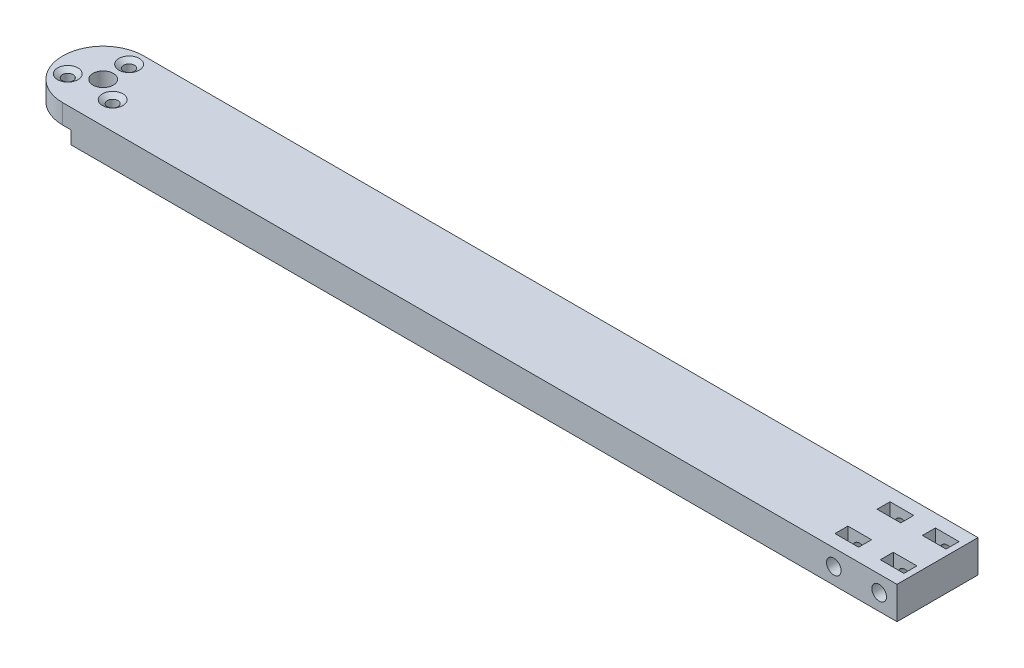
ISO-10303-21;
HEADER;
FILE_DESCRIPTION(('STEP AP214'),'2;1');
FILE_NAME('part.step','',(''),(''),'','','');
FILE_SCHEMA(('AUTOMOTIVE_DESIGN { 1 0 10303 214 1 1 1 1 }'));
ENDSEC;
DATA;
#1=APPLICATION_CONTEXT('core data for automotive mechanical design processes');
#2=APPLICATION_PROTOCOL_DEFINITION('international standard','automotive_design',2000,#1);
#3=PRODUCT_CONTEXT('',#1,'mechanical');
#4=PRODUCT('Part','Part','',(#3));
#5=PRODUCT_RELATED_PRODUCT_CATEGORY('part','',(#4));
#6=PRODUCT_DEFINITION_FORMATION('','',#4);
#7=PRODUCT_DEFINITION_CONTEXT('part definition',#1,'design');
#8=PRODUCT_DEFINITION('design','',#6,#7);
#9=PRODUCT_DEFINITION_SHAPE('','',#8);
#10=(LENGTH_UNIT() NAMED_UNIT(*) SI_UNIT(.MILLI.,.METRE.));
#11=(NAMED_UNIT(*) PLANE_ANGLE_UNIT() SI_UNIT($,.RADIAN.));
#12=(NAMED_UNIT(*) SI_UNIT($,.STERADIAN.) SOLID_ANGLE_UNIT());
#13=UNCERTAINTY_MEASURE_WITH_UNIT(LENGTH_MEASURE(1.E-05),#10,'distance_accuracy_value','');
#14=(GEOMETRIC_REPRESENTATION_CONTEXT(3) GLOBAL_UNCERTAINTY_ASSIGNED_CONTEXT((#13)) GLOBAL_UNIT_ASSIGNED_CONTEXT((#10,
#11,#12)) REPRESENTATION_CONTEXT('',''));
#15=CARTESIAN_POINT('',(0.,0.,0.));
#16=DIRECTION('',(0.,0.,1.));
#17=DIRECTION('',(1.,0.,0.));
#18=AXIS2_PLACEMENT_3D('',#15,#16,#17);
#19=CARTESIAN_POINT('',(12.5,-0.000999999999999265,-12.5));
#20=DIRECTION('',(0.,1.,0.));
#21=DIRECTION('',(0.,0.,1.));
#22=AXIS2_PLACEMENT_3D('',#19,#20,#21);
#23=CYLINDRICAL_SURFACE('',#22,3.15);
#24=CARTESIAN_POINT('',(12.5,10.,-12.5));
#25=DIRECTION('',(0.,1.,0.));
#26=DIRECTION('',(0.,0.,1.));
#27=AXIS2_PLACEMENT_3D('',#24,#25,#26);
#28=CIRCLE('',#27,3.15);
#29=CARTESIAN_POINT('',(12.5,10.,-9.35));
#30=VERTEX_POINT('',#29);
#31=EDGE_CURVE('E254',#30,#30,#28,.T.);
#32=ORIENTED_EDGE('',*,*,#31,.T.);
#33=EDGE_LOOP('',(#32));
#34=FACE_BOUND('',#33,.T.);
#35=CARTESIAN_POINT('',(12.5,4.,-12.5));
#36=DIRECTION('',(0.,-1.,0.));
#37=DIRECTION('',(0.,0.,-1.));
#38=AXIS2_PLACEMENT_3D('',#35,#36,#37);
#39=CIRCLE('',#38,3.15);
#40=CARTESIAN_POINT('',(12.5,4.,-15.65));
#41=VERTEX_POINT('',#40);
#42=EDGE_CURVE('E211',#41,#41,#39,.F.);
#43=ORIENTED_EDGE('',*,*,#42,.F.);
#44=EDGE_LOOP('',(#43));
#45=FACE_BOUND('',#44,.T.);
#46=ADVANCED_FACE('F43',(#34,#45),#23,.F.);
#47=CARTESIAN_POINT('',(12.5,10.,-12.5));
#48=DIRECTION('',(0.,-1.,0.));
#49=DIRECTION('',(0.,0.,-1.));
#50=AXIS2_PLACEMENT_3D('',#47,#48,#49);
#51=CYLINDRICAL_SURFACE('',#50,12.5);
#52=DIRECTION('',(0.,-1.,0.));
#53=VECTOR('',#52,1.);
#54=CARTESIAN_POINT('',(12.5,10.,-25.));
#55=LINE('',#54,#53);
#56=CARTESIAN_POINT('',(12.5,4.,-25.));
#57=VERTEX_POINT('',#56);
#58=CARTESIAN_POINT('',(12.5,10.,-25.));
#59=VERTEX_POINT('',#58);
#60=EDGE_CURVE('E248',#57,#59,#55,.F.);
#61=ORIENTED_EDGE('',*,*,#60,.F.);
#62=CARTESIAN_POINT('',(12.5,4.,-12.5));
#63=DIRECTION('',(0.,-1.,0.));
#64=DIRECTION('',(0.,0.,-1.));
#65=AXIS2_PLACEMENT_3D('',#62,#63,#64);
#66=CIRCLE('',#65,12.5);
#67=CARTESIAN_POINT('',(0.,4.,-12.5));
#68=VERTEX_POINT('',#67);
#69=EDGE_CURVE('E343',#57,#68,#66,.F.);
#70=ORIENTED_EDGE('',*,*,#69,.T.);
#71=DIRECTION('',(0.,-1.,0.));
#72=VECTOR('',#71,1.);
#73=CARTESIAN_POINT('',(0.,10.,-12.5));
#74=LINE('',#73,#72);
#75=CARTESIAN_POINT('',(0.,10.,-12.5));
#76=VERTEX_POINT('',#75);
#77=EDGE_CURVE('E251',#76,#68,#74,.T.);
#78=ORIENTED_EDGE('',*,*,#77,.F.);
#79=CARTESIAN_POINT('',(12.5,10.,-12.5));
#80=DIRECTION('',(0.,-1.,0.));
#81=DIRECTION('',(0.,0.,-1.));
#82=AXIS2_PLACEMENT_3D('',#79,#80,#81);
#83=CIRCLE('',#82,12.5);
#84=EDGE_CURVE('E244',#59,#76,#83,.F.);
#85=ORIENTED_EDGE('',*,*,#84,.F.);
#86=EDGE_LOOP('',(#61,#70,#78,#85));
#87=FACE_BOUND('',#86,.T.);
#88=ADVANCED_FACE('F289',(#87),#51,.T.);
#89=CARTESIAN_POINT('',(12.5,10.,-12.5));
#90=DIRECTION('',(0.,-1.,0.));
#91=DIRECTION('',(0.,0.,-1.));
#92=AXIS2_PLACEMENT_3D('',#89,#90,#91);
#93=CYLINDRICAL_SURFACE('',#92,12.5);
#94=ORIENTED_EDGE('',*,*,#77,.T.);
#95=CARTESIAN_POINT('',(12.5,4.,-12.5));
#96=DIRECTION('',(0.,-1.,0.));
#97=DIRECTION('',(0.,0.,-1.));
#98=AXIS2_PLACEMENT_3D('',#95,#96,#97);
#99=CIRCLE('',#98,12.5);
#100=CARTESIAN_POINT('',(12.5,4.,0.));
#101=VERTEX_POINT('',#100);
#102=EDGE_CURVE('E250',#68,#101,#99,.F.);
#103=ORIENTED_EDGE('',*,*,#102,.T.);
#104=DIRECTION('',(0.,-1.,0.));
#105=VECTOR('',#104,1.);
#106=CARTESIAN_POINT('',(12.5,10.,0.));
#107=LINE('',#106,#105);
#108=CARTESIAN_POINT('',(12.5,10.,0.));
#109=VERTEX_POINT('',#108);
#110=EDGE_CURVE('E241',#109,#101,#107,.T.);
#111=ORIENTED_EDGE('',*,*,#110,.F.);
#112=CARTESIAN_POINT('',(12.5,10.,-12.5));
#113=DIRECTION('',(0.,-1.,0.));
#114=DIRECTION('',(0.,0.,-1.));
#115=AXIS2_PLACEMENT_3D('',#112,#113,#114);
#116=CIRCLE('',#115,12.5);
#117=EDGE_CURVE('E246',#76,#109,#116,.F.);
#118=ORIENTED_EDGE('',*,*,#117,.F.);
#119=EDGE_LOOP('',(#94,#103,#111,#118));
#120=FACE_BOUND('',#119,.T.);
#121=ADVANCED_FACE('F295',(#120),#93,.T.);
#122=CARTESIAN_POINT('',(250.5,5.00000000000016,0.));
#123=DIRECTION('',(0.,0.,-1.));
#124=DIRECTION('',(-1.,0.,0.));
#125=AXIS2_PLACEMENT_3D('',#122,#123,#124);
#126=CYLINDRICAL_SURFACE('',#125,2.24999999999995);
#127=CARTESIAN_POINT('',(250.5,5.00000000000016,-20.9999999999999));
#128=DIRECTION('',(0.,0.,-1.));
#129=DIRECTION('',(-1.,0.,0.));
#130=AXIS2_PLACEMENT_3D('',#127,#128,#129);
#131=CIRCLE('',#130,2.24999999999995);
#132=CARTESIAN_POINT('',(248.25,5.00000000000016,-20.9999999999999));
#133=VERTEX_POINT('',#132);
#134=EDGE_CURVE('E401',#133,#133,#131,.T.);
#135=ORIENTED_EDGE('',*,*,#134,.F.);
#136=EDGE_LOOP('',(#135));
#137=FACE_BOUND('',#136,.T.);
#138=CARTESIAN_POINT('',(250.5,5.00000000000016,-25.));
#139=DIRECTION('',(0.,0.,-1.));
#140=DIRECTION('',(-1.,0.,0.));
#141=AXIS2_PLACEMENT_3D('',#138,#139,#140);
#142=CIRCLE('',#141,2.24999999999995);
#143=CARTESIAN_POINT('',(248.25,5.00000000000016,-25.));
#144=VERTEX_POINT('',#143);
#145=EDGE_CURVE('E469',#144,#144,#142,.T.);
#146=ORIENTED_EDGE('',*,*,#145,.T.);
#147=EDGE_LOOP('',(#146));
#148=FACE_BOUND('',#147,.T.);
#149=ADVANCED_FACE('F323',(#137,#148),#126,.F.);
#150=CARTESIAN_POINT('',(264.5,4.99999999999997,0.));
#151=DIRECTION('',(0.,0.,-1.));
#152=DIRECTION('',(-1.,0.,0.));
#153=AXIS2_PLACEMENT_3D('',#150,#151,#152);
#154=CYLINDRICAL_SURFACE('',#153,2.25000000000007);
#155=CARTESIAN_POINT('',(264.5,4.99999999999997,-4.));
#156=DIRECTION('',(0.,0.,1.));
#157=DIRECTION('',(1.,0.,0.));
#158=AXIS2_PLACEMENT_3D('',#155,#156,#157);
#159=CIRCLE('',#158,2.25000000000007);
#160=CARTESIAN_POINT('',(266.75,4.99999999999997,-4.));
#161=VERTEX_POINT('',#160);
#162=EDGE_CURVE('E420',#161,#161,#159,.T.);
#163=ORIENTED_EDGE('',*,*,#162,.F.);
#164=EDGE_LOOP('',(#163));
#165=FACE_BOUND('',#164,.T.);
#166=CARTESIAN_POINT('',(264.5,4.99999999999997,0.));
#167=DIRECTION('',(0.,0.,-1.));
#168=DIRECTION('',(-1.,0.,0.));
#169=AXIS2_PLACEMENT_3D('',#166,#167,#168);
#170=CIRCLE('',#169,2.25000000000007);
#171=CARTESIAN_POINT('',(262.25,4.99999999999997,0.));
#172=VERTEX_POINT('',#171);
#173=EDGE_CURVE('E255',#172,#172,#170,.T.);
#174=ORIENTED_EDGE('',*,*,#173,.F.);
#175=EDGE_LOOP('',(#174));
#176=FACE_BOUND('',#175,.T.);
#177=ADVANCED_FACE('F320',(#165,#176),#154,.F.);
#178=CARTESIAN_POINT('',(0.,10.,0.));
#179=DIRECTION('',(0.,0.,-1.));
#180=DIRECTION('',(-1.,0.,0.));
#181=AXIS2_PLACEMENT_3D('',#178,#179,#180);
#182=PLANE('',#181);
#183=ORIENTED_EDGE('',*,*,#173,.T.);
#184=EDGE_LOOP('',(#183));
#185=FACE_BOUND('',#184,.T.);
#186=CARTESIAN_POINT('',(250.5,5.00000000000016,0.));
#187=DIRECTION('',(0.,0.,-1.));
#188=DIRECTION('',(-1.,0.,0.));
#189=AXIS2_PLACEMENT_3D('',#186,#187,#188);
#190=CIRCLE('',#189,2.24999999999995);
#191=CARTESIAN_POINT('',(248.25,5.00000000000016,0.));
#192=VERTEX_POINT('',#191);
#193=EDGE_CURVE('E509',#192,#192,#190,.T.);
#194=ORIENTED_EDGE('',*,*,#193,.T.);
#195=EDGE_LOOP('',(#194));
#196=FACE_BOUND('',#195,.T.);
#197=DIRECTION('',(-1.,0.,0.));
#198=VECTOR('',#197,1.);
#199=CARTESIAN_POINT('',(0.,4.,0.));
#200=LINE('',#199,#198);
#201=CARTESIAN_POINT('',(15.0124689052802,4.,0.));
#202=VERTEX_POINT('',#201);
#203=EDGE_CURVE('E59',#202,#101,#200,.T.);
#204=ORIENTED_EDGE('',*,*,#203,.F.);
#205=DIRECTION('',(0.,-1.,0.));
#206=VECTOR('',#205,1.);
#207=CARTESIAN_POINT('',(15.0124689052802,4.,0.));
#208=LINE('',#207,#206);
#209=CARTESIAN_POINT('',(15.0124689052802,0.,0.));
#210=VERTEX_POINT('',#209);
#211=EDGE_CURVE('E210',#202,#210,#208,.T.);
#212=ORIENTED_EDGE('',*,*,#211,.T.);
#213=DIRECTION('',(1.,0.,0.));
#214=VECTOR('',#213,1.);
#215=CARTESIAN_POINT('',(0.,0.,0.));
#216=LINE('',#215,#214);
#217=CARTESIAN_POINT('',(270.,0.,0.));
#218=VERTEX_POINT('',#217);
#219=EDGE_CURVE('E220',#210,#218,#216,.T.);
#220=ORIENTED_EDGE('',*,*,#219,.T.);
#221=DIRECTION('',(0.,-1.,0.));
#222=VECTOR('',#221,1.);
#223=CARTESIAN_POINT('',(270.,10.,0.));
#224=LINE('',#223,#222);
#225=CARTESIAN_POINT('',(270.,10.,0.));
#226=VERTEX_POINT('',#225);
#227=EDGE_CURVE('E237',#226,#218,#224,.T.);
#228=ORIENTED_EDGE('',*,*,#227,.F.);
#229=DIRECTION('',(1.,0.,0.));
#230=VECTOR('',#229,1.);
#231=CARTESIAN_POINT('',(0.,10.,0.));
#232=LINE('',#231,#230);
#233=EDGE_CURVE('E228',#109,#226,#232,.T.);
#234=ORIENTED_EDGE('',*,*,#233,.F.);
#235=ORIENTED_EDGE('',*,*,#110,.T.);
#236=EDGE_LOOP('',(#204,#212,#220,#228,#234,#235));
#237=FACE_BOUND('',#236,.T.);
#238=ADVANCED_FACE('F316',(#185,#196,#237),#182,.F.);
#239=CARTESIAN_POINT('',(270.,10.,0.));
#240=DIRECTION('',(-1.,0.,0.));
#241=DIRECTION('',(0.,0.,1.));
#242=AXIS2_PLACEMENT_3D('',#239,#240,#241);
#243=PLANE('',#242);
#244=DIRECTION('',(0.,0.,-1.));
#245=VECTOR('',#244,1.);
#246=CARTESIAN_POINT('',(270.,0.,0.));
#247=LINE('',#246,#245);
#248=CARTESIAN_POINT('',(270.,0.,-25.));
#249=VERTEX_POINT('',#248);
#250=EDGE_CURVE('E229',#218,#249,#247,.T.);
#251=ORIENTED_EDGE('',*,*,#250,.T.);
#252=DIRECTION('',(0.,-1.,0.));
#253=VECTOR('',#252,1.);
#254=CARTESIAN_POINT('',(270.,10.,-25.));
#255=LINE('',#254,#253);
#256=CARTESIAN_POINT('',(270.,10.,-25.));
#257=VERTEX_POINT('',#256);
#258=EDGE_CURVE('E227',#257,#249,#255,.T.);
#259=ORIENTED_EDGE('',*,*,#258,.F.);
#260=DIRECTION('',(0.,0.,-1.));
#261=VECTOR('',#260,1.);
#262=CARTESIAN_POINT('',(270.,10.,0.));
#263=LINE('',#262,#261);
#264=EDGE_CURVE('E231',#226,#257,#263,.T.);
#265=ORIENTED_EDGE('',*,*,#264,.F.);
#266=ORIENTED_EDGE('',*,*,#227,.T.);
#267=EDGE_LOOP('',(#251,#259,#265,#266));
#268=FACE_BOUND('',#267,.T.);
#269=ADVANCED_FACE('F312',(#268),#243,.F.);
#270=CARTESIAN_POINT('',(0.,10.,-25.));
#271=DIRECTION('',(0.,0.,1.));
#272=DIRECTION('',(1.,0.,0.));
#273=AXIS2_PLACEMENT_3D('',#270,#271,#272);
#274=PLANE('',#273);
#275=CARTESIAN_POINT('',(264.5,4.99999999999997,-25.));
#276=DIRECTION('',(0.,0.,-1.));
#277=DIRECTION('',(-1.,0.,0.));
#278=AXIS2_PLACEMENT_3D('',#275,#276,#277);
#279=CIRCLE('',#278,2.25000000000007);
#280=CARTESIAN_POINT('',(262.25,4.99999999999997,-25.));
#281=VERTEX_POINT('',#280);
#282=EDGE_CURVE('E506',#281,#281,#279,.T.);
#283=ORIENTED_EDGE('',*,*,#282,.F.);
#284=EDGE_LOOP('',(#283));
#285=FACE_BOUND('',#284,.T.);
#286=ORIENTED_EDGE('',*,*,#145,.F.);
#287=EDGE_LOOP('',(#286));
#288=FACE_BOUND('',#287,.T.);
#289=DIRECTION('',(-1.,0.,0.));
#290=VECTOR('',#289,1.);
#291=CARTESIAN_POINT('',(0.,0.,-25.));
#292=LINE('',#291,#290);
#293=CARTESIAN_POINT('',(15.0124689052802,0.,-25.));
#294=VERTEX_POINT('',#293);
#295=EDGE_CURVE('E219',#249,#294,#292,.T.);
#296=ORIENTED_EDGE('',*,*,#295,.T.);
#297=DIRECTION('',(0.,-1.,0.));
#298=VECTOR('',#297,1.);
#299=CARTESIAN_POINT('',(15.0124689052802,4.,-25.));
#300=LINE('',#299,#298);
#301=CARTESIAN_POINT('',(15.0124689052802,4.,-25.));
#302=VERTEX_POINT('',#301);
#303=EDGE_CURVE('E201',#294,#302,#300,.F.);
#304=ORIENTED_EDGE('',*,*,#303,.T.);
#305=DIRECTION('',(1.,0.,0.));
#306=VECTOR('',#305,1.);
#307=CARTESIAN_POINT('',(0.,4.,-25.));
#308=LINE('',#307,#306);
#309=EDGE_CURVE('E344',#57,#302,#308,.T.);
#310=ORIENTED_EDGE('',*,*,#309,.F.);
#311=ORIENTED_EDGE('',*,*,#60,.T.);
#312=DIRECTION('',(-1.,0.,0.));
#313=VECTOR('',#312,1.);
#314=CARTESIAN_POINT('',(0.,10.,-25.));
#315=LINE('',#314,#313);
#316=EDGE_CURVE('E238',#257,#59,#315,.T.);
#317=ORIENTED_EDGE('',*,*,#316,.F.);
#318=ORIENTED_EDGE('',*,*,#258,.T.);
#319=EDGE_LOOP('',(#296,#304,#310,#311,#317,#318));
#320=FACE_BOUND('',#319,.T.);
#321=ADVANCED_FACE('F224',(#285,#288,#320),#274,.F.);
#322=CARTESIAN_POINT('',(0.,10.,0.));
#323=DIRECTION('',(0.,-1.,0.));
#324=DIRECTION('',(0.,0.,-1.));
#325=AXIS2_PLACEMENT_3D('',#322,#323,#324);
#326=PLANE('',#325);
#327=CARTESIAN_POINT('',(5.57179676972453,10.,-8.49999999999998));
#328=DIRECTION('',(0.,-1.,0.));
#329=DIRECTION('',(0.,0.,-1.));
#330=AXIS2_PLACEMENT_3D('',#327,#328,#329);
#331=CIRCLE('',#330,3.14999999999999);
#332=CARTESIAN_POINT('',(5.57179676972453,10.,-11.65));
#333=VERTEX_POINT('',#332);
#334=EDGE_CURVE('E266',#333,#333,#331,.T.);
#335=ORIENTED_EDGE('',*,*,#334,.T.);
#336=EDGE_LOOP('',(#335));
#337=FACE_BOUND('',#336,.T.);
#338=CARTESIAN_POINT('',(19.4282032302756,10.,-8.50000000000001));
#339=DIRECTION('',(0.,-1.,0.));
#340=DIRECTION('',(0.,0.,-1.));
#341=AXIS2_PLACEMENT_3D('',#338,#339,#340);
#342=CIRCLE('',#341,3.14999999999993);
#343=CARTESIAN_POINT('',(19.4282032302756,10.,-11.6499999999999));
#344=VERTEX_POINT('',#343);
#345=EDGE_CURVE('E263',#344,#344,#342,.T.);
#346=ORIENTED_EDGE('',*,*,#345,.T.);
#347=EDGE_LOOP('',(#346));
#348=FACE_BOUND('',#347,.T.);
#349=CARTESIAN_POINT('',(12.5,10.,-20.5));
#350=DIRECTION('',(0.,-1.,0.));
#351=DIRECTION('',(0.,0.,-1.));
#352=AXIS2_PLACEMENT_3D('',#349,#350,#351);
#353=CIRCLE('',#352,3.14999999999999);
#354=CARTESIAN_POINT('',(12.5,10.,-23.65));
#355=VERTEX_POINT('',#354);
#356=EDGE_CURVE('E260',#355,#355,#353,.T.);
#357=ORIENTED_EDGE('',*,*,#356,.T.);
#358=EDGE_LOOP('',(#357));
#359=FACE_BOUND('',#358,.T.);
#360=DIRECTION('',(1.,0.,0.));
#361=VECTOR('',#360,1.);
#362=CARTESIAN_POINT('',(260.85,10.,-4.));
#363=LINE('',#362,#361);
#364=CARTESIAN_POINT('',(260.85,10.,-4.));
#365=VERTEX_POINT('',#364);
#366=CARTESIAN_POINT('',(268.15,10.,-4.));
#367=VERTEX_POINT('',#366);
#368=EDGE_CURVE('E67',#365,#367,#363,.T.);
#369=ORIENTED_EDGE('',*,*,#368,.F.);
#370=DIRECTION('',(0.,0.,1.));
#371=VECTOR('',#370,1.);
#372=CARTESIAN_POINT('',(260.85,10.,-8.));
#373=LINE('',#372,#371);
#374=CARTESIAN_POINT('',(260.85,10.,-8.));
#375=VERTEX_POINT('',#374);
#376=EDGE_CURVE('E407',#375,#365,#373,.T.);
#377=ORIENTED_EDGE('',*,*,#376,.F.);
#378=DIRECTION('',(-1.,0.,0.));
#379=VECTOR('',#378,1.);
#380=CARTESIAN_POINT('',(260.85,10.,-8.));
#381=LINE('',#380,#379);
#382=CARTESIAN_POINT('',(268.15,10.,-8.));
#383=VERTEX_POINT('',#382);
#384=EDGE_CURVE('E414',#383,#375,#381,.T.);
#385=ORIENTED_EDGE('',*,*,#384,.F.);
#386=DIRECTION('',(0.,0.,-1.));
#387=VECTOR('',#386,1.);
#388=CARTESIAN_POINT('',(268.15,10.,-8.));
#389=LINE('',#388,#387);
#390=EDGE_CURVE('E411',#367,#383,#389,.T.);
#391=ORIENTED_EDGE('',*,*,#390,.F.);
#392=EDGE_LOOP('',(#369,#377,#385,#391));
#393=FACE_BOUND('',#392,.T.);
#394=DIRECTION('',(-1.,0.,0.));
#395=VECTOR('',#394,1.);
#396=CARTESIAN_POINT('',(246.85,10.,-20.9999999999999));
#397=LINE('',#396,#395);
#398=CARTESIAN_POINT('',(254.15,10.,-20.9999999999999));
#399=VERTEX_POINT('',#398);
#400=CARTESIAN_POINT('',(246.85,10.,-20.9999999999999));
#401=VERTEX_POINT('',#400);
#402=EDGE_CURVE('E438',#399,#401,#397,.T.);
#403=ORIENTED_EDGE('',*,*,#402,.F.);
#404=DIRECTION('',(0.,0.,-1.));
#405=VECTOR('',#404,1.);
#406=CARTESIAN_POINT('',(254.15,10.,-16.9999999999999));
#407=LINE('',#406,#405);
#408=CARTESIAN_POINT('',(254.15,10.,-16.9999999999999));
#409=VERTEX_POINT('',#408);
#410=EDGE_CURVE('E449',#409,#399,#407,.T.);
#411=ORIENTED_EDGE('',*,*,#410,.F.);
#412=DIRECTION('',(1.,0.,0.));
#413=VECTOR('',#412,1.);
#414=CARTESIAN_POINT('',(246.85,10.,-16.9999999999999));
#415=LINE('',#414,#413);
#416=CARTESIAN_POINT('',(246.85,10.,-16.9999999999999));
#417=VERTEX_POINT('',#416);
#418=EDGE_CURVE('E446',#417,#409,#415,.T.);
#419=ORIENTED_EDGE('',*,*,#418,.F.);
#420=DIRECTION('',(0.,0.,1.));
#421=VECTOR('',#420,1.);
#422=CARTESIAN_POINT('',(246.85,10.,-16.9999999999999));
#423=LINE('',#422,#421);
#424=EDGE_CURVE('E443',#401,#417,#423,.T.);
#425=ORIENTED_EDGE('',*,*,#424,.F.);
#426=EDGE_LOOP('',(#403,#411,#419,#425));
#427=FACE_BOUND('',#426,.T.);
#428=DIRECTION('',(1.,0.,0.));
#429=VECTOR('',#428,1.);
#430=CARTESIAN_POINT('',(246.85,10.,-3.9999999999999));
#431=LINE('',#430,#429);
#432=CARTESIAN_POINT('',(246.85,10.,-3.9999999999999));
#433=VERTEX_POINT('',#432);
#434=CARTESIAN_POINT('',(254.15,10.,-3.99999999999991));
#435=VERTEX_POINT('',#434);
#436=EDGE_CURVE('E370',#433,#435,#431,.T.);
#437=ORIENTED_EDGE('',*,*,#436,.F.);
#438=DIRECTION('',(0.,0.,1.));
#439=VECTOR('',#438,1.);
#440=CARTESIAN_POINT('',(246.85,10.,-7.9999999999999));
#441=LINE('',#440,#439);
#442=CARTESIAN_POINT('',(246.85,10.,-7.9999999999999));
#443=VERTEX_POINT('',#442);
#444=EDGE_CURVE('E367',#443,#433,#441,.T.);
#445=ORIENTED_EDGE('',*,*,#444,.F.);
#446=DIRECTION('',(-1.,0.,0.));
#447=VECTOR('',#446,1.);
#448=CARTESIAN_POINT('',(246.85,10.,-7.9999999999999));
#449=LINE('',#448,#447);
#450=CARTESIAN_POINT('',(254.15,10.,-7.9999999999999));
#451=VERTEX_POINT('',#450);
#452=EDGE_CURVE('E375',#451,#443,#449,.T.);
#453=ORIENTED_EDGE('',*,*,#452,.F.);
#454=DIRECTION('',(0.,0.,-1.));
#455=VECTOR('',#454,1.);
#456=CARTESIAN_POINT('',(254.15,10.,-7.9999999999999));
#457=LINE('',#456,#455);
#458=EDGE_CURVE('E372',#435,#451,#457,.T.);
#459=ORIENTED_EDGE('',*,*,#458,.F.);
#460=EDGE_LOOP('',(#437,#445,#453,#459));
#461=FACE_BOUND('',#460,.T.);
#462=DIRECTION('',(-1.,0.,0.));
#463=VECTOR('',#462,1.);
#464=CARTESIAN_POINT('',(260.85,10.,-21.));
#465=LINE('',#464,#463);
#466=CARTESIAN_POINT('',(268.15,10.,-21.));
#467=VERTEX_POINT('',#466);
#468=CARTESIAN_POINT('',(260.85,10.,-21.));
#469=VERTEX_POINT('',#468);
#470=EDGE_CURVE('E482',#467,#469,#465,.T.);
#471=ORIENTED_EDGE('',*,*,#470,.F.);
#472=DIRECTION('',(0.,0.,-1.));
#473=VECTOR('',#472,1.);
#474=CARTESIAN_POINT('',(268.15,10.,-17.));
#475=LINE('',#474,#473);
#476=CARTESIAN_POINT('',(268.15,10.,-17.));
#477=VERTEX_POINT('',#476);
#478=EDGE_CURVE('E479',#477,#467,#475,.T.);
#479=ORIENTED_EDGE('',*,*,#478,.F.);
#480=DIRECTION('',(1.,0.,0.));
#481=VECTOR('',#480,1.);
#482=CARTESIAN_POINT('',(260.85,10.,-17.));
#483=LINE('',#482,#481);
#484=CARTESIAN_POINT('',(260.85,10.,-17.));
#485=VERTEX_POINT('',#484);
#486=EDGE_CURVE('E487',#485,#477,#483,.T.);
#487=ORIENTED_EDGE('',*,*,#486,.F.);
#488=DIRECTION('',(0.,0.,1.));
#489=VECTOR('',#488,1.);
#490=CARTESIAN_POINT('',(260.85,10.,-17.));
#491=LINE('',#490,#489);
#492=EDGE_CURVE('E484',#469,#485,#491,.T.);
#493=ORIENTED_EDGE('',*,*,#492,.F.);
#494=EDGE_LOOP('',(#471,#479,#487,#493));
#495=FACE_BOUND('',#494,.T.);
#496=ORIENTED_EDGE('',*,*,#31,.F.);
#497=EDGE_LOOP('',(#496));
#498=FACE_BOUND('',#497,.T.);
#499=ORIENTED_EDGE('',*,*,#84,.T.);
#500=ORIENTED_EDGE('',*,*,#117,.T.);
#501=ORIENTED_EDGE('',*,*,#233,.T.);
#502=ORIENTED_EDGE('',*,*,#264,.T.);
#503=ORIENTED_EDGE('',*,*,#316,.T.);
#504=EDGE_LOOP('',(#499,#500,#501,#502,#503));
#505=FACE_BOUND('',#504,.T.);
#506=ADVANCED_FACE('F304',(#337,#348,#359,#393,#427,#461,#495,#498,#505),#326,.F.);
#507=CARTESIAN_POINT('',(0.,0.,0.));
#508=DIRECTION('',(0.,-1.,0.));
#509=DIRECTION('',(0.,0.,-1.));
#510=AXIS2_PLACEMENT_3D('',#507,#508,#509);
#511=PLANE('',#510);
#512=CARTESIAN_POINT('',(12.5,0.,-12.5));
#513=DIRECTION('',(0.,-1.,0.));
#514=DIRECTION('',(0.,0.,-1.));
#515=AXIS2_PLACEMENT_3D('',#512,#513,#514);
#516=CIRCLE('',#515,12.75);
#517=EDGE_CURVE('E204',#294,#210,#516,.T.);
#518=ORIENTED_EDGE('',*,*,#517,.F.);
#519=ORIENTED_EDGE('',*,*,#295,.F.);
#520=ORIENTED_EDGE('',*,*,#250,.F.);
#521=ORIENTED_EDGE('',*,*,#219,.F.);
#522=EDGE_LOOP('',(#518,#519,#520,#521));
#523=FACE_BOUND('',#522,.T.);
#524=DIRECTION('',(0.,0.,1.));
#525=VECTOR('',#524,1.);
#526=CARTESIAN_POINT('',(260.85,0.,-8.));
#527=LINE('',#526,#525);
#528=CARTESIAN_POINT('',(260.85,0.,-8.));
#529=VERTEX_POINT('',#528);
#530=CARTESIAN_POINT('',(260.85,0.,-4.));
#531=VERTEX_POINT('',#530);
#532=EDGE_CURVE('E404',#529,#531,#527,.T.);
#533=ORIENTED_EDGE('',*,*,#532,.T.);
#534=DIRECTION('',(1.,0.,0.));
#535=VECTOR('',#534,1.);
#536=CARTESIAN_POINT('',(260.85,0.,-4.));
#537=LINE('',#536,#535);
#538=CARTESIAN_POINT('',(268.15,0.,-4.));
#539=VERTEX_POINT('',#538);
#540=EDGE_CURVE('E396',#531,#539,#537,.T.);
#541=ORIENTED_EDGE('',*,*,#540,.T.);
#542=DIRECTION('',(0.,0.,-1.));
#543=VECTOR('',#542,1.);
#544=CARTESIAN_POINT('',(268.15,0.,-8.));
#545=LINE('',#544,#543);
#546=CARTESIAN_POINT('',(268.15,0.,-8.));
#547=VERTEX_POINT('',#546);
#548=EDGE_CURVE('E397',#539,#547,#545,.T.);
#549=ORIENTED_EDGE('',*,*,#548,.T.);
#550=DIRECTION('',(-1.,0.,0.));
#551=VECTOR('',#550,1.);
#552=CARTESIAN_POINT('',(260.85,0.,-8.));
#553=LINE('',#552,#551);
#554=EDGE_CURVE('E400',#547,#529,#553,.T.);
#555=ORIENTED_EDGE('',*,*,#554,.T.);
#556=EDGE_LOOP('',(#533,#541,#549,#555));
#557=FACE_BOUND('',#556,.T.);
#558=DIRECTION('',(0.,0.,-1.));
#559=VECTOR('',#558,1.);
#560=CARTESIAN_POINT('',(254.15,0.,-16.9999999999999));
#561=LINE('',#560,#559);
#562=CARTESIAN_POINT('',(254.15,0.,-16.9999999999999));
#563=VERTEX_POINT('',#562);
#564=CARTESIAN_POINT('',(254.15,0.,-20.9999999999999));
#565=VERTEX_POINT('',#564);
#566=EDGE_CURVE('E432',#563,#565,#561,.T.);
#567=ORIENTED_EDGE('',*,*,#566,.T.);
#568=DIRECTION('',(-1.,0.,0.));
#569=VECTOR('',#568,1.);
#570=CARTESIAN_POINT('',(246.85,0.,-20.9999999999999));
#571=LINE('',#570,#569);
#572=CARTESIAN_POINT('',(246.85,0.,-20.9999999999999));
#573=VERTEX_POINT('',#572);
#574=EDGE_CURVE('E435',#565,#573,#571,.T.);
#575=ORIENTED_EDGE('',*,*,#574,.T.);
#576=DIRECTION('',(0.,0.,1.));
#577=VECTOR('',#576,1.);
#578=CARTESIAN_POINT('',(246.85,0.,-16.9999999999999));
#579=LINE('',#578,#577);
#580=CARTESIAN_POINT('',(246.85,0.,-16.9999999999999));
#581=VERTEX_POINT('',#580);
#582=EDGE_CURVE('E455',#573,#581,#579,.T.);
#583=ORIENTED_EDGE('',*,*,#582,.T.);
#584=DIRECTION('',(1.,0.,0.));
#585=VECTOR('',#584,1.);
#586=CARTESIAN_POINT('',(246.85,0.,-16.9999999999999));
#587=LINE('',#586,#585);
#588=EDGE_CURVE('E357',#581,#563,#587,.T.);
#589=ORIENTED_EDGE('',*,*,#588,.T.);
#590=EDGE_LOOP('',(#567,#575,#583,#589));
#591=FACE_BOUND('',#590,.T.);
#592=DIRECTION('',(0.,0.,1.));
#593=VECTOR('',#592,1.);
#594=CARTESIAN_POINT('',(246.85,0.,-7.9999999999999));
#595=LINE('',#594,#593);
#596=CARTESIAN_POINT('',(246.85,0.,-7.9999999999999));
#597=VERTEX_POINT('',#596);
#598=CARTESIAN_POINT('',(246.85,0.,-3.9999999999999));
#599=VERTEX_POINT('',#598);
#600=EDGE_CURVE('E364',#597,#599,#595,.T.);
#601=ORIENTED_EDGE('',*,*,#600,.T.);
#602=DIRECTION('',(1.,0.,0.));
#603=VECTOR('',#602,1.);
#604=CARTESIAN_POINT('',(246.85,0.,-3.9999999999999));
#605=LINE('',#604,#603);
#606=CARTESIAN_POINT('',(254.15,0.,-3.99999999999991));
#607=VERTEX_POINT('',#606);
#608=EDGE_CURVE('E358',#599,#607,#605,.T.);
#609=ORIENTED_EDGE('',*,*,#608,.T.);
#610=DIRECTION('',(0.,0.,-1.));
#611=VECTOR('',#610,1.);
#612=CARTESIAN_POINT('',(254.15,0.,-7.9999999999999));
#613=LINE('',#612,#611);
#614=CARTESIAN_POINT('',(254.15,0.,-7.9999999999999));
#615=VERTEX_POINT('',#614);
#616=EDGE_CURVE('E353',#607,#615,#613,.T.);
#617=ORIENTED_EDGE('',*,*,#616,.T.);
#618=DIRECTION('',(-1.,0.,0.));
#619=VECTOR('',#618,1.);
#620=CARTESIAN_POINT('',(246.85,0.,-7.9999999999999));
#621=LINE('',#620,#619);
#622=EDGE_CURVE('E361',#615,#597,#621,.T.);
#623=ORIENTED_EDGE('',*,*,#622,.T.);
#624=EDGE_LOOP('',(#601,#609,#617,#623));
#625=FACE_BOUND('',#624,.T.);
#626=DIRECTION('',(0.,0.,-1.));
#627=VECTOR('',#626,1.);
#628=CARTESIAN_POINT('',(268.15,0.,-17.));
#629=LINE('',#628,#627);
#630=CARTESIAN_POINT('',(268.15,0.,-17.));
#631=VERTEX_POINT('',#630);
#632=CARTESIAN_POINT('',(268.15,0.,-21.));
#633=VERTEX_POINT('',#632);
#634=EDGE_CURVE('E476',#631,#633,#629,.T.);
#635=ORIENTED_EDGE('',*,*,#634,.T.);
#636=DIRECTION('',(-1.,0.,0.));
#637=VECTOR('',#636,1.);
#638=CARTESIAN_POINT('',(260.85,0.,-21.));
#639=LINE('',#638,#637);
#640=CARTESIAN_POINT('',(260.85,0.,-21.));
#641=VERTEX_POINT('',#640);
#642=EDGE_CURVE('E470',#633,#641,#639,.T.);
#643=ORIENTED_EDGE('',*,*,#642,.T.);
#644=DIRECTION('',(0.,0.,1.));
#645=VECTOR('',#644,1.);
#646=CARTESIAN_POINT('',(260.85,0.,-17.));
#647=LINE('',#646,#645);
#648=CARTESIAN_POINT('',(260.85,0.,-17.));
#649=VERTEX_POINT('',#648);
#650=EDGE_CURVE('E395',#641,#649,#647,.T.);
#651=ORIENTED_EDGE('',*,*,#650,.T.);
#652=DIRECTION('',(1.,0.,0.));
#653=VECTOR('',#652,1.);
#654=CARTESIAN_POINT('',(260.85,0.,-17.));
#655=LINE('',#654,#653);
#656=EDGE_CURVE('E473',#649,#631,#655,.T.);
#657=ORIENTED_EDGE('',*,*,#656,.T.);
#658=EDGE_LOOP('',(#635,#643,#651,#657));
#659=FACE_BOUND('',#658,.T.);
#660=ADVANCED_FACE('F216',(#523,#557,#591,#625,#659),#511,.T.);
#661=CARTESIAN_POINT('',(250.5,5.00000000000016,-3.9999999999999));
#662=DIRECTION('',(0.,0.,1.));
#663=DIRECTION('',(1.,0.,0.));
#664=AXIS2_PLACEMENT_3D('',#661,#662,#663);
#665=CIRCLE('',#664,2.24999999999995);
#666=CARTESIAN_POINT('',(252.75,5.00000000000016,-3.9999999999999));
#667=VERTEX_POINT('',#666);
#668=EDGE_CURVE('E381',#667,#667,#665,.T.);
#669=ORIENTED_EDGE('',*,*,#668,.F.);
#670=EDGE_LOOP('',(#669));
#671=FACE_BOUND('',#670,.T.);
#672=ORIENTED_EDGE('',*,*,#193,.F.);
#673=EDGE_LOOP('',(#672));
#674=FACE_BOUND('',#673,.T.);
#675=ADVANCED_FACE('F302',(#671,#674),#126,.F.);
#676=CARTESIAN_POINT('',(264.5,4.99999999999997,-21.));
#677=DIRECTION('',(0.,0.,-1.));
#678=DIRECTION('',(-1.,0.,0.));
#679=AXIS2_PLACEMENT_3D('',#676,#677,#678);
#680=CIRCLE('',#679,2.25000000000007);
#681=CARTESIAN_POINT('',(262.25,4.99999999999997,-21.));
#682=VERTEX_POINT('',#681);
#683=EDGE_CURVE('E493',#682,#682,#680,.T.);
#684=ORIENTED_EDGE('',*,*,#683,.F.);
#685=EDGE_LOOP('',(#684));
#686=FACE_BOUND('',#685,.T.);
#687=ORIENTED_EDGE('',*,*,#282,.T.);
#688=EDGE_LOOP('',(#687));
#689=FACE_BOUND('',#688,.T.);
#690=ADVANCED_FACE('F592',(#686,#689),#154,.F.);
#691=CARTESIAN_POINT('',(260.85,-0.000999999999999265,-17.));
#692=DIRECTION('',(0.,0.,1.));
#693=DIRECTION('',(1.,0.,0.));
#694=AXIS2_PLACEMENT_3D('',#691,#692,#693);
#695=PLANE('',#694);
#696=CARTESIAN_POINT('',(264.5,4.99999999999997,-17.));
#697=DIRECTION('',(0.,0.,1.));
#698=DIRECTION('',(1.,0.,0.));
#699=AXIS2_PLACEMENT_3D('',#696,#697,#698);
#700=CIRCLE('',#699,2.25000000000007);
#701=CARTESIAN_POINT('',(266.75,4.99999999999997,-17.));
#702=VERTEX_POINT('',#701);
#703=EDGE_CURVE('E466',#702,#702,#700,.T.);
#704=ORIENTED_EDGE('',*,*,#703,.T.);
#705=EDGE_LOOP('',(#704));
#706=FACE_BOUND('',#705,.T.);
#707=DIRECTION('',(0.,1.,0.));
#708=VECTOR('',#707,1.);
#709=CARTESIAN_POINT('',(260.85,-0.000999999999999265,-17.));
#710=LINE('',#709,#708);
#711=EDGE_CURVE('E494',#649,#485,#710,.T.);
#712=ORIENTED_EDGE('',*,*,#711,.T.);
#713=ORIENTED_EDGE('',*,*,#486,.T.);
#714=DIRECTION('',(0.,1.,0.));
#715=VECTOR('',#714,1.);
#716=CARTESIAN_POINT('',(268.15,-0.000999999999999265,-17.));
#717=LINE('',#716,#715);
#718=EDGE_CURVE('E491',#631,#477,#717,.T.);
#719=ORIENTED_EDGE('',*,*,#718,.F.);
#720=ORIENTED_EDGE('',*,*,#656,.F.);
#721=EDGE_LOOP('',(#712,#713,#719,#720));
#722=FACE_BOUND('',#721,.T.);
#723=ADVANCED_FACE('F588',(#706,#722),#695,.F.);
#724=CARTESIAN_POINT('',(260.85,-0.000999999999999265,-21.));
#725=DIRECTION('',(0.,0.,-1.));
#726=DIRECTION('',(-1.,0.,0.));
#727=AXIS2_PLACEMENT_3D('',#724,#725,#726);
#728=PLANE('',#727);
#729=ORIENTED_EDGE('',*,*,#683,.T.);
#730=EDGE_LOOP('',(#729));
#731=FACE_BOUND('',#730,.T.);
#732=DIRECTION('',(0.,1.,0.));
#733=VECTOR('',#732,1.);
#734=CARTESIAN_POINT('',(268.15,-0.000999999999999265,-21.));
#735=LINE('',#734,#733);
#736=EDGE_CURVE('E490',#633,#467,#735,.T.);
#737=ORIENTED_EDGE('',*,*,#736,.T.);
#738=ORIENTED_EDGE('',*,*,#470,.T.);
#739=DIRECTION('',(0.,1.,0.));
#740=VECTOR('',#739,1.);
#741=CARTESIAN_POINT('',(260.85,-0.000999999999999265,-21.));
#742=LINE('',#741,#740);
#743=EDGE_CURVE('E496',#641,#469,#742,.T.);
#744=ORIENTED_EDGE('',*,*,#743,.F.);
#745=ORIENTED_EDGE('',*,*,#642,.F.);
#746=EDGE_LOOP('',(#737,#738,#744,#745));
#747=FACE_BOUND('',#746,.T.);
#748=ADVANCED_FACE('F591',(#731,#747),#728,.F.);
#749=CARTESIAN_POINT('',(268.15,-0.000999999999999265,-17.));
#750=DIRECTION('',(1.,0.,0.));
#751=DIRECTION('',(0.,0.,-1.));
#752=AXIS2_PLACEMENT_3D('',#749,#750,#751);
#753=PLANE('',#752);
#754=ORIENTED_EDGE('',*,*,#718,.T.);
#755=ORIENTED_EDGE('',*,*,#478,.T.);
#756=ORIENTED_EDGE('',*,*,#736,.F.);
#757=ORIENTED_EDGE('',*,*,#634,.F.);
#758=EDGE_LOOP('',(#754,#755,#756,#757));
#759=FACE_BOUND('',#758,.T.);
#760=ADVANCED_FACE('F597',(#759),#753,.F.);
#761=CARTESIAN_POINT('',(260.85,-0.000999999999999265,-17.));
#762=DIRECTION('',(-1.,0.,0.));
#763=DIRECTION('',(0.,0.,1.));
#764=AXIS2_PLACEMENT_3D('',#761,#762,#763);
#765=PLANE('',#764);
#766=ORIENTED_EDGE('',*,*,#743,.T.);
#767=ORIENTED_EDGE('',*,*,#492,.T.);
#768=ORIENTED_EDGE('',*,*,#711,.F.);
#769=ORIENTED_EDGE('',*,*,#650,.F.);
#770=EDGE_LOOP('',(#766,#767,#768,#769));
#771=FACE_BOUND('',#770,.T.);
#772=ADVANCED_FACE('F594',(#771),#765,.F.);
#773=CARTESIAN_POINT('',(264.5,4.99999999999997,-8.));
#774=DIRECTION('',(0.,0.,-1.));
#775=DIRECTION('',(-1.,0.,0.));
#776=AXIS2_PLACEMENT_3D('',#773,#774,#775);
#777=CIRCLE('',#776,2.25000000000007);
#778=CARTESIAN_POINT('',(262.25,4.99999999999997,-8.));
#779=VERTEX_POINT('',#778);
#780=EDGE_CURVE('E392',#779,#779,#777,.T.);
#781=ORIENTED_EDGE('',*,*,#780,.F.);
#782=EDGE_LOOP('',(#781));
#783=FACE_BOUND('',#782,.T.);
#784=ORIENTED_EDGE('',*,*,#703,.F.);
#785=EDGE_LOOP('',(#784));
#786=FACE_BOUND('',#785,.T.);
#787=ADVANCED_FACE('F561',(#783,#786),#154,.F.);
#788=CARTESIAN_POINT('',(260.85,-0.000999999999999265,-8.));
#789=DIRECTION('',(0.,0.,-1.));
#790=DIRECTION('',(-1.,0.,0.));
#791=AXIS2_PLACEMENT_3D('',#788,#789,#790);
#792=PLANE('',#791);
#793=ORIENTED_EDGE('',*,*,#780,.T.);
#794=EDGE_LOOP('',(#793));
#795=FACE_BOUND('',#794,.T.);
#796=DIRECTION('',(0.,1.,0.));
#797=VECTOR('',#796,1.);
#798=CARTESIAN_POINT('',(268.15,-0.000999999999999265,-8.));
#799=LINE('',#798,#797);
#800=EDGE_CURVE('E421',#547,#383,#799,.T.);
#801=ORIENTED_EDGE('',*,*,#800,.T.);
#802=ORIENTED_EDGE('',*,*,#384,.T.);
#803=DIRECTION('',(0.,1.,0.));
#804=VECTOR('',#803,1.);
#805=CARTESIAN_POINT('',(260.85,-0.000999999999999265,-8.));
#806=LINE('',#805,#804);
#807=EDGE_CURVE('E418',#529,#375,#806,.T.);
#808=ORIENTED_EDGE('',*,*,#807,.F.);
#809=ORIENTED_EDGE('',*,*,#554,.F.);
#810=EDGE_LOOP('',(#801,#802,#808,#809));
#811=FACE_BOUND('',#810,.T.);
#812=ADVANCED_FACE('F557',(#795,#811),#792,.F.);
#813=CARTESIAN_POINT('',(260.85,-0.000999999999999265,-4.));
#814=DIRECTION('',(0.,0.,1.));
#815=DIRECTION('',(1.,0.,0.));
#816=AXIS2_PLACEMENT_3D('',#813,#814,#815);
#817=PLANE('',#816);
#818=ORIENTED_EDGE('',*,*,#162,.T.);
#819=EDGE_LOOP('',(#818));
#820=FACE_BOUND('',#819,.T.);
#821=DIRECTION('',(0.,1.,0.));
#822=VECTOR('',#821,1.);
#823=CARTESIAN_POINT('',(260.85,-0.000999999999999265,-4.));
#824=LINE('',#823,#822);
#825=EDGE_CURVE('E417',#531,#365,#824,.T.);
#826=ORIENTED_EDGE('',*,*,#825,.T.);
#827=ORIENTED_EDGE('',*,*,#368,.T.);
#828=DIRECTION('',(0.,1.,0.));
#829=VECTOR('',#828,1.);
#830=CARTESIAN_POINT('',(268.15,-0.000999999999999265,-4.));
#831=LINE('',#830,#829);
#832=EDGE_CURVE('E423',#539,#367,#831,.T.);
#833=ORIENTED_EDGE('',*,*,#832,.F.);
#834=ORIENTED_EDGE('',*,*,#540,.F.);
#835=EDGE_LOOP('',(#826,#827,#833,#834));
#836=FACE_BOUND('',#835,.T.);
#837=ADVANCED_FACE('F560',(#820,#836),#817,.F.);
#838=CARTESIAN_POINT('',(260.85,-0.000999999999999265,-8.));
#839=DIRECTION('',(-1.,0.,0.));
#840=DIRECTION('',(0.,0.,1.));
#841=AXIS2_PLACEMENT_3D('',#838,#839,#840);
#842=PLANE('',#841);
#843=ORIENTED_EDGE('',*,*,#807,.T.);
#844=ORIENTED_EDGE('',*,*,#376,.T.);
#845=ORIENTED_EDGE('',*,*,#825,.F.);
#846=ORIENTED_EDGE('',*,*,#532,.F.);
#847=EDGE_LOOP('',(#843,#844,#845,#846));
#848=FACE_BOUND('',#847,.T.);
#849=ADVANCED_FACE('F565',(#848),#842,.F.);
#850=CARTESIAN_POINT('',(268.15,-0.000999999999999265,-8.));
#851=DIRECTION('',(1.,0.,0.));
#852=DIRECTION('',(0.,0.,-1.));
#853=AXIS2_PLACEMENT_3D('',#850,#851,#852);
#854=PLANE('',#853);
#855=ORIENTED_EDGE('',*,*,#832,.T.);
#856=ORIENTED_EDGE('',*,*,#390,.T.);
#857=ORIENTED_EDGE('',*,*,#800,.F.);
#858=ORIENTED_EDGE('',*,*,#548,.F.);
#859=EDGE_LOOP('',(#855,#856,#857,#858));
#860=FACE_BOUND('',#859,.T.);
#861=ADVANCED_FACE('F544',(#860),#854,.F.);
#862=CARTESIAN_POINT('',(246.85,-0.000999999999999265,-7.9999999999999));
#863=DIRECTION('',(0.,0.,-1.));
#864=DIRECTION('',(-1.,0.,0.));
#865=AXIS2_PLACEMENT_3D('',#862,#863,#864);
#866=PLANE('',#865);
#867=CARTESIAN_POINT('',(250.5,5.00000000000016,-7.9999999999999));
#868=DIRECTION('',(0.,0.,-1.));
#869=DIRECTION('',(-1.,0.,0.));
#870=AXIS2_PLACEMENT_3D('',#867,#868,#869);
#871=CIRCLE('',#870,2.24999999999995);
#872=CARTESIAN_POINT('',(248.25,5.00000000000016,-7.9999999999999));
#873=VERTEX_POINT('',#872);
#874=EDGE_CURVE('E354',#873,#873,#871,.T.);
#875=ORIENTED_EDGE('',*,*,#874,.T.);
#876=EDGE_LOOP('',(#875));
#877=FACE_BOUND('',#876,.T.);
#878=DIRECTION('',(0.,1.,0.));
#879=VECTOR('',#878,1.);
#880=CARTESIAN_POINT('',(254.15,-0.000999999999999265,-7.9999999999999));
#881=LINE('',#880,#879);
#882=EDGE_CURVE('E382',#615,#451,#881,.T.);
#883=ORIENTED_EDGE('',*,*,#882,.T.);
#884=ORIENTED_EDGE('',*,*,#452,.T.);
#885=DIRECTION('',(0.,1.,0.));
#886=VECTOR('',#885,1.);
#887=CARTESIAN_POINT('',(246.85,-0.000999999999999265,-7.9999999999999));
#888=LINE('',#887,#886);
#889=EDGE_CURVE('E379',#597,#443,#888,.T.);
#890=ORIENTED_EDGE('',*,*,#889,.F.);
#891=ORIENTED_EDGE('',*,*,#622,.F.);
#892=EDGE_LOOP('',(#883,#884,#890,#891));
#893=FACE_BOUND('',#892,.T.);
#894=ADVANCED_FACE('F540',(#877,#893),#866,.F.);
#895=CARTESIAN_POINT('',(246.85,-0.000999999999999265,-3.9999999999999));
#896=DIRECTION('',(0.,0.,1.));
#897=DIRECTION('',(1.,0.,0.));
#898=AXIS2_PLACEMENT_3D('',#895,#896,#897);
#899=PLANE('',#898);
#900=ORIENTED_EDGE('',*,*,#668,.T.);
#901=EDGE_LOOP('',(#900));
#902=FACE_BOUND('',#901,.T.);
#903=DIRECTION('',(0.,1.,0.));
#904=VECTOR('',#903,1.);
#905=CARTESIAN_POINT('',(246.85,-0.000999999999999265,-3.9999999999999));
#906=LINE('',#905,#904);
#907=EDGE_CURVE('E378',#599,#433,#906,.T.);
#908=ORIENTED_EDGE('',*,*,#907,.T.);
#909=ORIENTED_EDGE('',*,*,#436,.T.);
#910=DIRECTION('',(0.,1.,0.));
#911=VECTOR('',#910,1.);
#912=CARTESIAN_POINT('',(254.15,-0.000999999999999265,-3.99999999999991));
#913=LINE('',#912,#911);
#914=EDGE_CURVE('E384',#607,#435,#913,.T.);
#915=ORIENTED_EDGE('',*,*,#914,.F.);
#916=ORIENTED_EDGE('',*,*,#608,.F.);
#917=EDGE_LOOP('',(#908,#909,#915,#916));
#918=FACE_BOUND('',#917,.T.);
#919=ADVANCED_FACE('F543',(#902,#918),#899,.F.);
#920=CARTESIAN_POINT('',(246.85,-0.000999999999999265,-7.9999999999999));
#921=DIRECTION('',(-1.,0.,0.));
#922=DIRECTION('',(0.,0.,1.));
#923=AXIS2_PLACEMENT_3D('',#920,#921,#922);
#924=PLANE('',#923);
#925=ORIENTED_EDGE('',*,*,#889,.T.);
#926=ORIENTED_EDGE('',*,*,#444,.T.);
#927=ORIENTED_EDGE('',*,*,#907,.F.);
#928=ORIENTED_EDGE('',*,*,#600,.F.);
#929=EDGE_LOOP('',(#925,#926,#927,#928));
#930=FACE_BOUND('',#929,.T.);
#931=ADVANCED_FACE('F549',(#930),#924,.F.);
#932=CARTESIAN_POINT('',(254.15,-0.000999999999999265,-7.9999999999999));
#933=DIRECTION('',(1.,0.,0.));
#934=DIRECTION('',(0.,0.,-1.));
#935=AXIS2_PLACEMENT_3D('',#932,#933,#934);
#936=PLANE('',#935);
#937=ORIENTED_EDGE('',*,*,#914,.T.);
#938=ORIENTED_EDGE('',*,*,#458,.T.);
#939=ORIENTED_EDGE('',*,*,#882,.F.);
#940=ORIENTED_EDGE('',*,*,#616,.F.);
#941=EDGE_LOOP('',(#937,#938,#939,#940));
#942=FACE_BOUND('',#941,.T.);
#943=ADVANCED_FACE('F546',(#942),#936,.F.);
#944=CARTESIAN_POINT('',(250.5,5.00000000000016,-16.9999999999999));
#945=DIRECTION('',(0.,0.,1.));
#946=DIRECTION('',(1.,0.,0.));
#947=AXIS2_PLACEMENT_3D('',#944,#945,#946);
#948=CIRCLE('',#947,2.24999999999995);
#949=CARTESIAN_POINT('',(252.75,5.00000000000016,-16.9999999999999));
#950=VERTEX_POINT('',#949);
#951=EDGE_CURVE('E441',#950,#950,#948,.T.);
#952=ORIENTED_EDGE('',*,*,#951,.F.);
#953=EDGE_LOOP('',(#952));
#954=FACE_BOUND('',#953,.T.);
#955=ORIENTED_EDGE('',*,*,#874,.F.);
#956=EDGE_LOOP('',(#955));
#957=FACE_BOUND('',#956,.T.);
#958=ADVANCED_FACE('F336',(#954,#957),#126,.F.);
#959=CARTESIAN_POINT('',(246.85,-0.000999999999999265,-20.9999999999999));
#960=DIRECTION('',(0.,0.,-1.));
#961=DIRECTION('',(-1.,0.,0.));
#962=AXIS2_PLACEMENT_3D('',#959,#960,#961);
#963=PLANE('',#962);
#964=ORIENTED_EDGE('',*,*,#134,.T.);
#965=EDGE_LOOP('',(#964));
#966=FACE_BOUND('',#965,.T.);
#967=DIRECTION('',(0.,1.,0.));
#968=VECTOR('',#967,1.);
#969=CARTESIAN_POINT('',(254.15,-0.000999999999999265,-20.9999999999999));
#970=LINE('',#969,#968);
#971=EDGE_CURVE('E453',#565,#399,#970,.T.);
#972=ORIENTED_EDGE('',*,*,#971,.T.);
#973=ORIENTED_EDGE('',*,*,#402,.T.);
#974=DIRECTION('',(0.,1.,0.));
#975=VECTOR('',#974,1.);
#976=CARTESIAN_POINT('',(246.85,-0.000999999999999265,-20.9999999999999));
#977=LINE('',#976,#975);
#978=EDGE_CURVE('E452',#573,#401,#977,.T.);
#979=ORIENTED_EDGE('',*,*,#978,.F.);
#980=ORIENTED_EDGE('',*,*,#574,.F.);
#981=EDGE_LOOP('',(#972,#973,#979,#980));
#982=FACE_BOUND('',#981,.T.);
#983=ADVANCED_FACE('F580',(#966,#982),#963,.F.);
#984=CARTESIAN_POINT('',(246.85,-0.000999999999999265,-16.9999999999999));
#985=DIRECTION('',(0.,0.,1.));
#986=DIRECTION('',(1.,0.,0.));
#987=AXIS2_PLACEMENT_3D('',#984,#985,#986);
#988=PLANE('',#987);
#989=ORIENTED_EDGE('',*,*,#951,.T.);
#990=EDGE_LOOP('',(#989));
#991=FACE_BOUND('',#990,.T.);
#992=DIRECTION('',(0.,1.,0.));
#993=VECTOR('',#992,1.);
#994=CARTESIAN_POINT('',(246.85,-0.000999999999999265,-16.9999999999999));
#995=LINE('',#994,#993);
#996=EDGE_CURVE('E458',#581,#417,#995,.T.);
#997=ORIENTED_EDGE('',*,*,#996,.T.);
#998=ORIENTED_EDGE('',*,*,#418,.T.);
#999=DIRECTION('',(0.,1.,0.));
#1000=VECTOR('',#999,1.);
#1001=CARTESIAN_POINT('',(254.15,-0.000999999999999265,-16.9999999999999));
#1002=LINE('',#1001,#1000);
#1003=EDGE_CURVE('E456',#563,#409,#1002,.T.);
#1004=ORIENTED_EDGE('',*,*,#1003,.F.);
#1005=ORIENTED_EDGE('',*,*,#588,.F.);
#1006=EDGE_LOOP('',(#997,#998,#1004,#1005));
#1007=FACE_BOUND('',#1006,.T.);
#1008=ADVANCED_FACE('F576',(#991,#1007),#988,.F.);
#1009=CARTESIAN_POINT('',(254.15,-0.000999999999999265,-16.9999999999999));
#1010=DIRECTION('',(1.,0.,0.));
#1011=DIRECTION('',(0.,0.,-1.));
#1012=AXIS2_PLACEMENT_3D('',#1009,#1010,#1011);
#1013=PLANE('',#1012);
#1014=ORIENTED_EDGE('',*,*,#1003,.T.);
#1015=ORIENTED_EDGE('',*,*,#410,.T.);
#1016=ORIENTED_EDGE('',*,*,#971,.F.);
#1017=ORIENTED_EDGE('',*,*,#566,.F.);
#1018=EDGE_LOOP('',(#1014,#1015,#1016,#1017));
#1019=FACE_BOUND('',#1018,.T.);
#1020=ADVANCED_FACE('F573',(#1019),#1013,.F.);
#1021=CARTESIAN_POINT('',(246.85,-0.000999999999999265,-16.9999999999999));
#1022=DIRECTION('',(-1.,0.,0.));
#1023=DIRECTION('',(0.,0.,1.));
#1024=AXIS2_PLACEMENT_3D('',#1021,#1022,#1023);
#1025=PLANE('',#1024);
#1026=ORIENTED_EDGE('',*,*,#978,.T.);
#1027=ORIENTED_EDGE('',*,*,#424,.T.);
#1028=ORIENTED_EDGE('',*,*,#996,.F.);
#1029=ORIENTED_EDGE('',*,*,#582,.F.);
#1030=EDGE_LOOP('',(#1026,#1027,#1028,#1029));
#1031=FACE_BOUND('',#1030,.T.);
#1032=ADVANCED_FACE('F534',(#1031),#1025,.F.);
#1033=CARTESIAN_POINT('',(12.5,4.,-12.5));
#1034=DIRECTION('',(0.,-1.,0.));
#1035=DIRECTION('',(0.,0.,-1.));
#1036=AXIS2_PLACEMENT_3D('',#1033,#1034,#1035);
#1037=CYLINDRICAL_SURFACE('',#1036,12.75);
#1038=CARTESIAN_POINT('',(12.5,4.,-12.5));
#1039=DIRECTION('',(0.,-1.,0.));
#1040=DIRECTION('',(0.,0.,-1.));
#1041=AXIS2_PLACEMENT_3D('',#1038,#1039,#1040);
#1042=CIRCLE('',#1041,12.75);
#1043=EDGE_CURVE('E206',#302,#202,#1042,.T.);
#1044=ORIENTED_EDGE('',*,*,#1043,.F.);
#1045=ORIENTED_EDGE('',*,*,#303,.F.);
#1046=ORIENTED_EDGE('',*,*,#517,.T.);
#1047=ORIENTED_EDGE('',*,*,#211,.F.);
#1048=EDGE_LOOP('',(#1044,#1045,#1046,#1047));
#1049=FACE_BOUND('',#1048,.T.);
#1050=ADVANCED_FACE('F203',(#1049),#1037,.F.);
#1051=CARTESIAN_POINT('',(12.5,4.,-12.5));
#1052=DIRECTION('',(0.,-1.,0.));
#1053=DIRECTION('',(0.,0.,-1.));
#1054=AXIS2_PLACEMENT_3D('',#1051,#1052,#1053);
#1055=PLANE('',#1054);
#1056=CARTESIAN_POINT('',(12.5,4.,-20.5));
#1057=DIRECTION('',(0.,-1.,0.));
#1058=DIRECTION('',(0.,0.,-1.));
#1059=AXIS2_PLACEMENT_3D('',#1056,#1057,#1058);
#1060=CIRCLE('',#1059,1.65);
#1061=CARTESIAN_POINT('',(12.5,4.,-22.15));
#1062=VERTEX_POINT('',#1061);
#1063=EDGE_CURVE('E221',#1062,#1062,#1060,.T.);
#1064=ORIENTED_EDGE('',*,*,#1063,.F.);
#1065=EDGE_LOOP('',(#1064));
#1066=FACE_BOUND('',#1065,.T.);
#1067=CARTESIAN_POINT('',(5.57179676972453,4.,-8.49999999999998));
#1068=DIRECTION('',(0.,-1.,0.));
#1069=DIRECTION('',(0.,0.,-1.));
#1070=AXIS2_PLACEMENT_3D('',#1067,#1068,#1069);
#1071=CIRCLE('',#1070,1.64999999999999);
#1072=CARTESIAN_POINT('',(5.57179676972453,4.,-10.15));
#1073=VERTEX_POINT('',#1072);
#1074=EDGE_CURVE('E883',#1073,#1073,#1071,.T.);
#1075=ORIENTED_EDGE('',*,*,#1074,.F.);
#1076=EDGE_LOOP('',(#1075));
#1077=FACE_BOUND('',#1076,.T.);
#1078=CARTESIAN_POINT('',(19.4282032302756,4.,-8.50000000000001));
#1079=DIRECTION('',(0.,-1.,0.));
#1080=DIRECTION('',(0.,0.,-1.));
#1081=AXIS2_PLACEMENT_3D('',#1078,#1079,#1080);
#1082=CIRCLE('',#1081,1.64999999999996);
#1083=CARTESIAN_POINT('',(19.4282032302756,4.,-10.15));
#1084=VERTEX_POINT('',#1083);
#1085=EDGE_CURVE('E886',#1084,#1084,#1082,.T.);
#1086=ORIENTED_EDGE('',*,*,#1085,.F.);
#1087=EDGE_LOOP('',(#1086));
#1088=FACE_BOUND('',#1087,.T.);
#1089=ORIENTED_EDGE('',*,*,#203,.T.);
#1090=ORIENTED_EDGE('',*,*,#102,.F.);
#1091=ORIENTED_EDGE('',*,*,#69,.F.);
#1092=ORIENTED_EDGE('',*,*,#309,.T.);
#1093=ORIENTED_EDGE('',*,*,#1043,.T.);
#1094=EDGE_LOOP('',(#1089,#1090,#1091,#1092,#1093));
#1095=FACE_BOUND('',#1094,.T.);
#1096=ORIENTED_EDGE('',*,*,#42,.T.);
#1097=EDGE_LOOP('',(#1096));
#1098=FACE_BOUND('',#1097,.T.);
#1099=ADVANCED_FACE('F522',(#1066,#1077,#1088,#1095,#1098),#1055,.T.);
#1100=CARTESIAN_POINT('',(19.4282032302756,10.001,-8.50000000000001));
#1101=DIRECTION('',(0.,-1.,0.));
#1102=DIRECTION('',(0.,0.,-1.));
#1103=AXIS2_PLACEMENT_3D('',#1100,#1101,#1102);
#1104=CYLINDRICAL_SURFACE('',#1103,1.64999999999996);
#1105=CARTESIAN_POINT('',(19.4282032302756,8.94968869268544,-8.50000000000001));
#1106=DIRECTION('',(0.,-1.,0.));
#1107=DIRECTION('',(0.,0.,-1.));
#1108=AXIS2_PLACEMENT_3D('',#1105,#1106,#1107);
#1109=CIRCLE('',#1108,1.64999999999996);
#1110=CARTESIAN_POINT('',(19.4282032302756,8.94968869268544,-10.15));
#1111=VERTEX_POINT('',#1110);
#1112=EDGE_CURVE('E52',#1111,#1111,#1109,.F.);
#1113=ORIENTED_EDGE('',*,*,#1112,.T.);
#1114=EDGE_LOOP('',(#1113));
#1115=FACE_BOUND('',#1114,.T.);
#1116=ORIENTED_EDGE('',*,*,#1085,.T.);
#1117=EDGE_LOOP('',(#1116));
#1118=FACE_BOUND('',#1117,.T.);
#1119=ADVANCED_FACE('F271',(#1115,#1118),#1104,.F.);
#1120=CARTESIAN_POINT('',(5.57179676972453,10.001,-8.49999999999998));
#1121=DIRECTION('',(0.,-1.,0.));
#1122=DIRECTION('',(0.,0.,-1.));
#1123=AXIS2_PLACEMENT_3D('',#1120,#1121,#1122);
#1124=CYLINDRICAL_SURFACE('',#1123,1.64999999999999);
#1125=CARTESIAN_POINT('',(5.57179676972453,8.94968869268543,-8.49999999999998));
#1126=DIRECTION('',(0.,-1.,0.));
#1127=DIRECTION('',(0.,0.,-1.));
#1128=AXIS2_PLACEMENT_3D('',#1125,#1126,#1127);
#1129=CIRCLE('',#1128,1.64999999999999);
#1130=CARTESIAN_POINT('',(5.57179676972453,8.94968869268543,-10.15));
#1131=VERTEX_POINT('',#1130);
#1132=EDGE_CURVE('E257',#1131,#1131,#1129,.F.);
#1133=ORIENTED_EDGE('',*,*,#1132,.T.);
#1134=EDGE_LOOP('',(#1133));
#1135=FACE_BOUND('',#1134,.T.);
#1136=ORIENTED_EDGE('',*,*,#1074,.T.);
#1137=EDGE_LOOP('',(#1136));
#1138=FACE_BOUND('',#1137,.T.);
#1139=ADVANCED_FACE('F532',(#1135,#1138),#1124,.F.);
#1140=CARTESIAN_POINT('',(12.5,10.001,-20.5));
#1141=DIRECTION('',(0.,-1.,0.));
#1142=DIRECTION('',(0.,0.,-1.));
#1143=AXIS2_PLACEMENT_3D('',#1140,#1141,#1142);
#1144=CYLINDRICAL_SURFACE('',#1143,1.65);
#1145=CARTESIAN_POINT('',(12.5,8.94968869268544,-20.5));
#1146=DIRECTION('',(0.,-1.,0.));
#1147=DIRECTION('',(0.,0.,-1.));
#1148=AXIS2_PLACEMENT_3D('',#1145,#1146,#1147);
#1149=CIRCLE('',#1148,1.65);
#1150=CARTESIAN_POINT('',(12.5,8.94968869268544,-22.15));
#1151=VERTEX_POINT('',#1150);
#1152=EDGE_CURVE('E12',#1151,#1151,#1149,.F.);
#1153=ORIENTED_EDGE('',*,*,#1152,.T.);
#1154=EDGE_LOOP('',(#1153));
#1155=FACE_BOUND('',#1154,.T.);
#1156=ORIENTED_EDGE('',*,*,#1063,.T.);
#1157=EDGE_LOOP('',(#1156));
#1158=FACE_BOUND('',#1157,.T.);
#1159=ADVANCED_FACE('F283',(#1155,#1158),#1144,.F.);
#1160=CARTESIAN_POINT('',(5.57179676972453,8.94968869268543,-8.49999999999998));
#1161=DIRECTION('',(0.,1.,0.));
#1162=DIRECTION('',(0.,0.,1.));
#1163=AXIS2_PLACEMENT_3D('',#1160,#1161,#1162);
#1164=CONICAL_SURFACE('',#1163,1.64999999999999,0.959931088596877);
#1165=ORIENTED_EDGE('',*,*,#334,.F.);
#1166=EDGE_LOOP('',(#1165));
#1167=FACE_BOUND('',#1166,.T.);
#1168=ORIENTED_EDGE('',*,*,#1132,.F.);
#1169=EDGE_LOOP('',(#1168));
#1170=FACE_BOUND('',#1169,.T.);
#1171=ADVANCED_FACE('F276',(#1167,#1170),#1164,.F.);
#1172=CARTESIAN_POINT('',(19.4282032302756,8.94968869268544,-8.50000000000001));
#1173=DIRECTION('',(0.,1.,0.));
#1174=DIRECTION('',(0.,0.,1.));
#1175=AXIS2_PLACEMENT_3D('',#1172,#1173,#1174);
#1176=CONICAL_SURFACE('',#1175,1.64999999999996,0.959931088596872);
#1177=ORIENTED_EDGE('',*,*,#345,.F.);
#1178=EDGE_LOOP('',(#1177));
#1179=FACE_BOUND('',#1178,.T.);
#1180=ORIENTED_EDGE('',*,*,#1112,.F.);
#1181=EDGE_LOOP('',(#1180));
#1182=FACE_BOUND('',#1181,.T.);
#1183=ADVANCED_FACE('F274',(#1179,#1182),#1176,.F.);
#1184=CARTESIAN_POINT('',(12.5,8.94968869268544,-20.5));
#1185=DIRECTION('',(0.,1.,0.));
#1186=DIRECTION('',(0.,0.,1.));
#1187=AXIS2_PLACEMENT_3D('',#1184,#1185,#1186);
#1188=CONICAL_SURFACE('',#1187,1.65,0.959931088596878);
#1189=ORIENTED_EDGE('',*,*,#356,.F.);
#1190=EDGE_LOOP('',(#1189));
#1191=FACE_BOUND('',#1190,.T.);
#1192=ORIENTED_EDGE('',*,*,#1152,.F.);
#1193=EDGE_LOOP('',(#1192));
#1194=FACE_BOUND('',#1193,.T.);
#1195=ADVANCED_FACE('F46',(#1191,#1194),#1188,.F.);
#1196=CLOSED_SHELL('',(#46,#88,#121,#149,#177,#238,#269,#321,#506,#660,#675,#690,#723,#748,#760,
#772,#787,#812,#837,#849,#861,#894,#919,#931,#943,#958,#983,#1008,#1020,#1032,#1050,#1099,#1119,
#1139,#1159,#1171,#1183,#1195));
#1197=MANIFOLD_SOLID_BREP('B2',#1196);
#1198=ADVANCED_BREP_SHAPE_REPRESENTATION('',(#18,#1197),#14);
#1199=SHAPE_DEFINITION_REPRESENTATION(#9,#1198);
ENDSEC;
END-ISO-10303-21;
